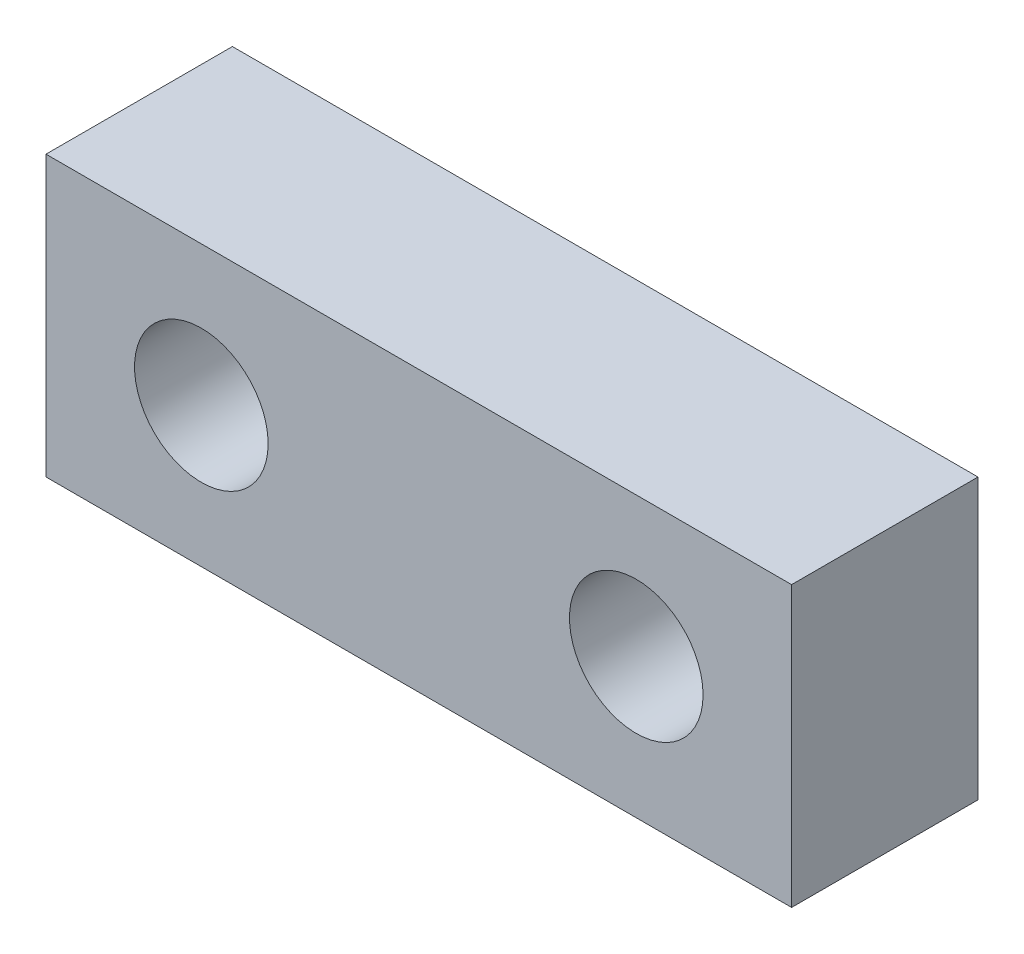
ISO-10303-21;
HEADER;
FILE_DESCRIPTION(('STEP AP214'),'2;1');
FILE_NAME('part.step','',(''),(''),'','','');
FILE_SCHEMA(('AUTOMOTIVE_DESIGN { 1 0 10303 214 1 1 1 1 }'));
ENDSEC;
DATA;
#1=APPLICATION_CONTEXT('core data for automotive mechanical design processes');
#2=APPLICATION_PROTOCOL_DEFINITION('international standard','automotive_design',2000,#1);
#3=PRODUCT_CONTEXT('',#1,'mechanical');
#4=PRODUCT('Part','Part','',(#3));
#5=PRODUCT_RELATED_PRODUCT_CATEGORY('part','',(#4));
#6=PRODUCT_DEFINITION_FORMATION('','',#4);
#7=PRODUCT_DEFINITION_CONTEXT('part definition',#1,'design');
#8=PRODUCT_DEFINITION('design','',#6,#7);
#9=PRODUCT_DEFINITION_SHAPE('','',#8);
#10=(LENGTH_UNIT() NAMED_UNIT(*) SI_UNIT(.MILLI.,.METRE.));
#11=(NAMED_UNIT(*) PLANE_ANGLE_UNIT() SI_UNIT($,.RADIAN.));
#12=(NAMED_UNIT(*) SI_UNIT($,.STERADIAN.) SOLID_ANGLE_UNIT());
#13=UNCERTAINTY_MEASURE_WITH_UNIT(LENGTH_MEASURE(1.E-05),#10,'distance_accuracy_value','');
#14=(GEOMETRIC_REPRESENTATION_CONTEXT(3) GLOBAL_UNCERTAINTY_ASSIGNED_CONTEXT((#13)) GLOBAL_UNIT_ASSIGNED_CONTEXT((#10,
#11,#12)) REPRESENTATION_CONTEXT('',''));
#15=CARTESIAN_POINT('',(0.,0.,0.));
#16=DIRECTION('',(0.,0.,1.));
#17=DIRECTION('',(1.,0.,0.));
#18=AXIS2_PLACEMENT_3D('',#15,#16,#17);
#19=CARTESIAN_POINT('',(60.,-22.5,30.));
#20=DIRECTION('',(-1.,0.,0.));
#21=DIRECTION('',(0.,0.,1.));
#22=AXIS2_PLACEMENT_3D('',#19,#20,#21);
#23=PLANE('',#22);
#24=DIRECTION('',(0.,1.,0.));
#25=VECTOR('',#24,1.);
#26=CARTESIAN_POINT('',(60.,-22.5,0.));
#27=LINE('',#26,#25);
#28=CARTESIAN_POINT('',(60.,-22.5,0.));
#29=VERTEX_POINT('',#28);
#30=CARTESIAN_POINT('',(60.,22.5,0.));
#31=VERTEX_POINT('',#30);
#32=EDGE_CURVE('E290',#29,#31,#27,.T.);
#33=ORIENTED_EDGE('',*,*,#32,.T.);
#34=DIRECTION('',(0.,0.,-1.));
#35=VECTOR('',#34,1.);
#36=CARTESIAN_POINT('',(60.,22.5,30.));
#37=LINE('',#36,#35);
#38=CARTESIAN_POINT('',(60.,22.5,30.));
#39=VERTEX_POINT('',#38);
#40=EDGE_CURVE('E11',#39,#31,#37,.T.);
#41=ORIENTED_EDGE('',*,*,#40,.F.);
#42=DIRECTION('',(0.,1.,0.));
#43=VECTOR('',#42,1.);
#44=CARTESIAN_POINT('',(60.,-22.5,30.));
#45=LINE('',#44,#43);
#46=CARTESIAN_POINT('',(60.,-22.5,30.));
#47=VERTEX_POINT('',#46);
#48=EDGE_CURVE('E294',#47,#39,#45,.T.);
#49=ORIENTED_EDGE('',*,*,#48,.F.);
#50=DIRECTION('',(0.,0.,-1.));
#51=VECTOR('',#50,1.);
#52=CARTESIAN_POINT('',(60.,-22.5,30.));
#53=LINE('',#52,#51);
#54=EDGE_CURVE('E304',#47,#29,#53,.T.);
#55=ORIENTED_EDGE('',*,*,#54,.T.);
#56=EDGE_LOOP('',(#33,#41,#49,#55));
#57=FACE_BOUND('',#56,.T.);
#58=ADVANCED_FACE('F43',(#57),#23,.F.);
#59=CARTESIAN_POINT('',(-60.,22.5,30.));
#60=DIRECTION('',(0.,-1.,0.));
#61=DIRECTION('',(0.,0.,-1.));
#62=AXIS2_PLACEMENT_3D('',#59,#60,#61);
#63=PLANE('',#62);
#64=DIRECTION('',(-1.,0.,0.));
#65=VECTOR('',#64,1.);
#66=CARTESIAN_POINT('',(-60.,22.5,0.));
#67=LINE('',#66,#65);
#68=CARTESIAN_POINT('',(-60.,22.5,0.));
#69=VERTEX_POINT('',#68);
#70=EDGE_CURVE('E308',#31,#69,#67,.T.);
#71=ORIENTED_EDGE('',*,*,#70,.T.);
#72=DIRECTION('',(0.,0.,-1.));
#73=VECTOR('',#72,1.);
#74=CARTESIAN_POINT('',(-60.,22.5,30.));
#75=LINE('',#74,#73);
#76=CARTESIAN_POINT('',(-60.,22.5,30.));
#77=VERTEX_POINT('',#76);
#78=EDGE_CURVE('E52',#77,#69,#75,.T.);
#79=ORIENTED_EDGE('',*,*,#78,.F.);
#80=DIRECTION('',(-1.,0.,0.));
#81=VECTOR('',#80,1.);
#82=CARTESIAN_POINT('',(-60.,22.5,30.));
#83=LINE('',#82,#81);
#84=EDGE_CURVE('E91',#39,#77,#83,.T.);
#85=ORIENTED_EDGE('',*,*,#84,.F.);
#86=ORIENTED_EDGE('',*,*,#40,.T.);
#87=EDGE_LOOP('',(#71,#79,#85,#86));
#88=FACE_BOUND('',#87,.T.);
#89=ADVANCED_FACE('F339',(#88),#63,.F.);
#90=CARTESIAN_POINT('',(-60.,-22.5,30.));
#91=DIRECTION('',(1.,0.,0.));
#92=DIRECTION('',(0.,0.,-1.));
#93=AXIS2_PLACEMENT_3D('',#90,#91,#92);
#94=PLANE('',#93);
#95=DIRECTION('',(0.,-1.,0.));
#96=VECTOR('',#95,1.);
#97=CARTESIAN_POINT('',(-60.,-22.5,0.));
#98=LINE('',#97,#96);
#99=CARTESIAN_POINT('',(-60.,-22.5,0.));
#100=VERTEX_POINT('',#99);
#101=EDGE_CURVE('E78',#69,#100,#98,.T.);
#102=ORIENTED_EDGE('',*,*,#101,.T.);
#103=DIRECTION('',(0.,0.,-1.));
#104=VECTOR('',#103,1.);
#105=CARTESIAN_POINT('',(-60.,-22.5,30.));
#106=LINE('',#105,#104);
#107=CARTESIAN_POINT('',(-60.,-22.5,30.));
#108=VERTEX_POINT('',#107);
#109=EDGE_CURVE('E317',#108,#100,#106,.T.);
#110=ORIENTED_EDGE('',*,*,#109,.F.);
#111=DIRECTION('',(0.,-1.,0.));
#112=VECTOR('',#111,1.);
#113=CARTESIAN_POINT('',(-60.,-22.5,30.));
#114=LINE('',#113,#112);
#115=EDGE_CURVE('E299',#77,#108,#114,.T.);
#116=ORIENTED_EDGE('',*,*,#115,.F.);
#117=ORIENTED_EDGE('',*,*,#78,.T.);
#118=EDGE_LOOP('',(#102,#110,#116,#117));
#119=FACE_BOUND('',#118,.T.);
#120=ADVANCED_FACE('F321',(#119),#94,.F.);
#121=CARTESIAN_POINT('',(-60.,-22.5,30.));
#122=DIRECTION('',(0.,1.,0.));
#123=DIRECTION('',(0.,0.,1.));
#124=AXIS2_PLACEMENT_3D('',#121,#122,#123);
#125=PLANE('',#124);
#126=CARTESIAN_POINT('',(40.6066017177982,-22.5,4.39339828220176));
#127=DIRECTION('',(0.,-1.,0.));
#128=DIRECTION('',(0.,0.,-1.));
#129=AXIS2_PLACEMENT_3D('',#126,#127,#128);
#130=CIRCLE('',#129,1.24999999999999);
#131=CARTESIAN_POINT('',(40.6066017177982,-22.5,3.14339828220177));
#132=VERTEX_POINT('',#131);
#133=EDGE_CURVE('E213',#132,#132,#130,.T.);
#134=ORIENTED_EDGE('',*,*,#133,.F.);
#135=EDGE_LOOP('',(#134));
#136=FACE_BOUND('',#135,.T.);
#137=CARTESIAN_POINT('',(19.3933982822018,-22.5,4.39339828220177));
#138=DIRECTION('',(0.,-1.,0.));
#139=DIRECTION('',(0.,0.,-1.));
#140=AXIS2_PLACEMENT_3D('',#137,#138,#139);
#141=CIRCLE('',#140,1.24999999999999);
#142=CARTESIAN_POINT('',(19.3933982822018,-22.5,3.14339828220179));
#143=VERTEX_POINT('',#142);
#144=EDGE_CURVE('E221',#143,#143,#141,.T.);
#145=ORIENTED_EDGE('',*,*,#144,.F.);
#146=EDGE_LOOP('',(#145));
#147=FACE_BOUND('',#146,.T.);
#148=CARTESIAN_POINT('',(19.3933982822018,-22.5,25.6066017177982));
#149=DIRECTION('',(0.,-1.,0.));
#150=DIRECTION('',(0.,0.,-1.));
#151=AXIS2_PLACEMENT_3D('',#148,#149,#150);
#152=CIRCLE('',#151,1.24999999999999);
#153=CARTESIAN_POINT('',(19.3933982822018,-22.5,24.3566017177982));
#154=VERTEX_POINT('',#153);
#155=EDGE_CURVE('E229',#154,#154,#152,.T.);
#156=ORIENTED_EDGE('',*,*,#155,.F.);
#157=EDGE_LOOP('',(#156));
#158=FACE_BOUND('',#157,.T.);
#159=CARTESIAN_POINT('',(40.6066017177982,-22.5,25.6066017177982));
#160=DIRECTION('',(0.,-1.,0.));
#161=DIRECTION('',(0.,0.,-1.));
#162=AXIS2_PLACEMENT_3D('',#159,#160,#161);
#163=CIRCLE('',#162,1.24999999999999);
#164=CARTESIAN_POINT('',(40.6066017177982,-22.5,24.3566017177982));
#165=VERTEX_POINT('',#164);
#166=EDGE_CURVE('E237',#165,#165,#163,.T.);
#167=ORIENTED_EDGE('',*,*,#166,.F.);
#168=EDGE_LOOP('',(#167));
#169=FACE_BOUND('',#168,.T.);
#170=CARTESIAN_POINT('',(-19.3933982822018,-22.5,4.39339828220179));
#171=DIRECTION('',(0.,-1.,0.));
#172=DIRECTION('',(0.,0.,-1.));
#173=AXIS2_PLACEMENT_3D('',#170,#171,#172);
#174=CIRCLE('',#173,1.24999999999999);
#175=CARTESIAN_POINT('',(-19.3933982822018,-22.5,3.14339828220181));
#176=VERTEX_POINT('',#175);
#177=EDGE_CURVE('E245',#176,#176,#174,.T.);
#178=ORIENTED_EDGE('',*,*,#177,.F.);
#179=EDGE_LOOP('',(#178));
#180=FACE_BOUND('',#179,.T.);
#181=CARTESIAN_POINT('',(-40.6066017177982,-22.5,4.39339828220179));
#182=DIRECTION('',(0.,-1.,0.));
#183=DIRECTION('',(0.,0.,-1.));
#184=AXIS2_PLACEMENT_3D('',#181,#182,#183);
#185=CIRCLE('',#184,1.24999999999999);
#186=CARTESIAN_POINT('',(-40.6066017177982,-22.5,3.14339828220181));
#187=VERTEX_POINT('',#186);
#188=EDGE_CURVE('E253',#187,#187,#185,.T.);
#189=ORIENTED_EDGE('',*,*,#188,.F.);
#190=EDGE_LOOP('',(#189));
#191=FACE_BOUND('',#190,.T.);
#192=CARTESIAN_POINT('',(-19.3933982822018,-22.5,25.6066017177982));
#193=DIRECTION('',(0.,-1.,0.));
#194=DIRECTION('',(0.,0.,-1.));
#195=AXIS2_PLACEMENT_3D('',#192,#193,#194);
#196=CIRCLE('',#195,1.24999999999999);
#197=CARTESIAN_POINT('',(-19.3933982822018,-22.5,24.3566017177982));
#198=VERTEX_POINT('',#197);
#199=EDGE_CURVE('E261',#198,#198,#196,.T.);
#200=ORIENTED_EDGE('',*,*,#199,.F.);
#201=EDGE_LOOP('',(#200));
#202=FACE_BOUND('',#201,.T.);
#203=CARTESIAN_POINT('',(-40.6066017177982,-22.5,25.6066017177982));
#204=DIRECTION('',(0.,-1.,0.));
#205=DIRECTION('',(0.,0.,-1.));
#206=AXIS2_PLACEMENT_3D('',#203,#204,#205);
#207=CIRCLE('',#206,1.24999999999999);
#208=CARTESIAN_POINT('',(-40.6066017177982,-22.5,24.3566017177982));
#209=VERTEX_POINT('',#208);
#210=EDGE_CURVE('E269',#209,#209,#207,.T.);
#211=ORIENTED_EDGE('',*,*,#210,.F.);
#212=EDGE_LOOP('',(#211));
#213=FACE_BOUND('',#212,.T.);
#214=DIRECTION('',(1.,0.,0.));
#215=VECTOR('',#214,1.);
#216=CARTESIAN_POINT('',(-60.,-22.5,0.));
#217=LINE('',#216,#215);
#218=EDGE_CURVE('E84',#100,#29,#217,.T.);
#219=ORIENTED_EDGE('',*,*,#218,.T.);
#220=ORIENTED_EDGE('',*,*,#54,.F.);
#221=DIRECTION('',(1.,0.,0.));
#222=VECTOR('',#221,1.);
#223=CARTESIAN_POINT('',(-60.,-22.5,30.));
#224=LINE('',#223,#222);
#225=EDGE_CURVE('E60',#108,#47,#224,.T.);
#226=ORIENTED_EDGE('',*,*,#225,.F.);
#227=ORIENTED_EDGE('',*,*,#109,.T.);
#228=EDGE_LOOP('',(#219,#220,#226,#227));
#229=FACE_BOUND('',#228,.T.);
#230=ADVANCED_FACE('F328',(#136,#147,#158,#169,#180,#191,#202,#213,#229),#125,.F.);
#231=CARTESIAN_POINT('',(0.,0.,30.));
#232=DIRECTION('',(0.,0.,-1.));
#233=DIRECTION('',(-1.,0.,0.));
#234=AXIS2_PLACEMENT_3D('',#231,#232,#233);
#235=PLANE('',#234);
#236=CARTESIAN_POINT('',(35.,0.,30.));
#237=DIRECTION('',(0.,0.,1.));
#238=DIRECTION('',(1.,0.,0.));
#239=AXIS2_PLACEMENT_3D('',#236,#237,#238);
#240=CIRCLE('',#239,10.75);
#241=CARTESIAN_POINT('',(45.75,0.,30.));
#242=VERTEX_POINT('',#241);
#243=EDGE_CURVE('E278',#242,#242,#240,.T.);
#244=ORIENTED_EDGE('',*,*,#243,.F.);
#245=EDGE_LOOP('',(#244));
#246=FACE_BOUND('',#245,.T.);
#247=CARTESIAN_POINT('',(-35.,0.,30.));
#248=DIRECTION('',(0.,0.,1.));
#249=DIRECTION('',(1.,0.,0.));
#250=AXIS2_PLACEMENT_3D('',#247,#248,#249);
#251=CIRCLE('',#250,10.75);
#252=CARTESIAN_POINT('',(-24.25,0.,30.));
#253=VERTEX_POINT('',#252);
#254=EDGE_CURVE('E286',#253,#253,#251,.T.);
#255=ORIENTED_EDGE('',*,*,#254,.F.);
#256=EDGE_LOOP('',(#255));
#257=FACE_BOUND('',#256,.T.);
#258=ORIENTED_EDGE('',*,*,#48,.T.);
#259=ORIENTED_EDGE('',*,*,#84,.T.);
#260=ORIENTED_EDGE('',*,*,#115,.T.);
#261=ORIENTED_EDGE('',*,*,#225,.T.);
#262=EDGE_LOOP('',(#258,#259,#260,#261));
#263=FACE_BOUND('',#262,.T.);
#264=ADVANCED_FACE('F330',(#246,#257,#263),#235,.F.);
#265=CARTESIAN_POINT('',(0.,0.,0.));
#266=DIRECTION('',(0.,0.,-1.));
#267=DIRECTION('',(-1.,0.,0.));
#268=AXIS2_PLACEMENT_3D('',#265,#266,#267);
#269=PLANE('',#268);
#270=CARTESIAN_POINT('',(-46.3,11.3,0.));
#271=DIRECTION('',(0.,0.,-1.));
#272=DIRECTION('',(-1.,0.,0.));
#273=AXIS2_PLACEMENT_3D('',#270,#271,#272);
#274=CIRCLE('',#273,1.64999999999999);
#275=CARTESIAN_POINT('',(-47.95,11.3,0.));
#276=VERTEX_POINT('',#275);
#277=EDGE_CURVE('E152',#276,#276,#274,.T.);
#278=ORIENTED_EDGE('',*,*,#277,.F.);
#279=EDGE_LOOP('',(#278));
#280=FACE_BOUND('',#279,.T.);
#281=CARTESIAN_POINT('',(-46.3,-11.3,0.));
#282=DIRECTION('',(0.,0.,-1.));
#283=DIRECTION('',(-1.,0.,0.));
#284=AXIS2_PLACEMENT_3D('',#281,#282,#283);
#285=CIRCLE('',#284,1.64999999999999);
#286=CARTESIAN_POINT('',(-47.95,-11.3,0.));
#287=VERTEX_POINT('',#286);
#288=EDGE_CURVE('E151',#287,#287,#285,.T.);
#289=ORIENTED_EDGE('',*,*,#288,.F.);
#290=EDGE_LOOP('',(#289));
#291=FACE_BOUND('',#290,.T.);
#292=CARTESIAN_POINT('',(-23.7,-11.3,0.));
#293=DIRECTION('',(0.,0.,-1.));
#294=DIRECTION('',(-1.,0.,0.));
#295=AXIS2_PLACEMENT_3D('',#292,#293,#294);
#296=CIRCLE('',#295,1.64999999999999);
#297=CARTESIAN_POINT('',(-25.35,-11.3,0.));
#298=VERTEX_POINT('',#297);
#299=EDGE_CURVE('E165',#298,#298,#296,.T.);
#300=ORIENTED_EDGE('',*,*,#299,.F.);
#301=EDGE_LOOP('',(#300));
#302=FACE_BOUND('',#301,.T.);
#303=CARTESIAN_POINT('',(-23.7,11.3,0.));
#304=DIRECTION('',(0.,0.,-1.));
#305=DIRECTION('',(-1.,0.,0.));
#306=AXIS2_PLACEMENT_3D('',#303,#304,#305);
#307=CIRCLE('',#306,1.64999999999999);
#308=CARTESIAN_POINT('',(-25.35,11.3,0.));
#309=VERTEX_POINT('',#308);
#310=EDGE_CURVE('E173',#309,#309,#307,.T.);
#311=ORIENTED_EDGE('',*,*,#310,.F.);
#312=EDGE_LOOP('',(#311));
#313=FACE_BOUND('',#312,.T.);
#314=CARTESIAN_POINT('',(23.7,11.3,0.));
#315=DIRECTION('',(0.,0.,-1.));
#316=DIRECTION('',(-1.,0.,0.));
#317=AXIS2_PLACEMENT_3D('',#314,#315,#316);
#318=CIRCLE('',#317,1.64999999999999);
#319=CARTESIAN_POINT('',(22.05,11.3,0.));
#320=VERTEX_POINT('',#319);
#321=EDGE_CURVE('E181',#320,#320,#318,.T.);
#322=ORIENTED_EDGE('',*,*,#321,.F.);
#323=EDGE_LOOP('',(#322));
#324=FACE_BOUND('',#323,.T.);
#325=CARTESIAN_POINT('',(23.7,-11.3,0.));
#326=DIRECTION('',(0.,0.,-1.));
#327=DIRECTION('',(-1.,0.,0.));
#328=AXIS2_PLACEMENT_3D('',#325,#326,#327);
#329=CIRCLE('',#328,1.64999999999999);
#330=CARTESIAN_POINT('',(22.05,-11.3,0.));
#331=VERTEX_POINT('',#330);
#332=EDGE_CURVE('E189',#331,#331,#329,.T.);
#333=ORIENTED_EDGE('',*,*,#332,.F.);
#334=EDGE_LOOP('',(#333));
#335=FACE_BOUND('',#334,.T.);
#336=CARTESIAN_POINT('',(46.3,-11.3,0.));
#337=DIRECTION('',(0.,0.,-1.));
#338=DIRECTION('',(-1.,0.,0.));
#339=AXIS2_PLACEMENT_3D('',#336,#337,#338);
#340=CIRCLE('',#339,1.64999999999999);
#341=CARTESIAN_POINT('',(44.65,-11.3,0.));
#342=VERTEX_POINT('',#341);
#343=EDGE_CURVE('E197',#342,#342,#340,.T.);
#344=ORIENTED_EDGE('',*,*,#343,.F.);
#345=EDGE_LOOP('',(#344));
#346=FACE_BOUND('',#345,.T.);
#347=CARTESIAN_POINT('',(46.3,11.3,0.));
#348=DIRECTION('',(0.,0.,-1.));
#349=DIRECTION('',(-1.,0.,0.));
#350=AXIS2_PLACEMENT_3D('',#347,#348,#349);
#351=CIRCLE('',#350,1.64999999999999);
#352=CARTESIAN_POINT('',(44.65,11.3,0.));
#353=VERTEX_POINT('',#352);
#354=EDGE_CURVE('E205',#353,#353,#351,.T.);
#355=ORIENTED_EDGE('',*,*,#354,.F.);
#356=EDGE_LOOP('',(#355));
#357=FACE_BOUND('',#356,.T.);
#358=CARTESIAN_POINT('',(35.,0.,0.));
#359=DIRECTION('',(0.,0.,-1.));
#360=DIRECTION('',(-1.,0.,0.));
#361=AXIS2_PLACEMENT_3D('',#358,#359,#360);
#362=CIRCLE('',#361,10.75);
#363=CARTESIAN_POINT('',(24.25,0.,0.));
#364=VERTEX_POINT('',#363);
#365=EDGE_CURVE('E277',#364,#364,#362,.F.);
#366=ORIENTED_EDGE('',*,*,#365,.T.);
#367=EDGE_LOOP('',(#366));
#368=FACE_BOUND('',#367,.T.);
#369=CARTESIAN_POINT('',(-35.,0.,0.));
#370=DIRECTION('',(0.,0.,-1.));
#371=DIRECTION('',(-1.,0.,0.));
#372=AXIS2_PLACEMENT_3D('',#369,#370,#371);
#373=CIRCLE('',#372,10.75);
#374=CARTESIAN_POINT('',(-45.75,0.,0.));
#375=VERTEX_POINT('',#374);
#376=EDGE_CURVE('E282',#375,#375,#373,.F.);
#377=ORIENTED_EDGE('',*,*,#376,.T.);
#378=EDGE_LOOP('',(#377));
#379=FACE_BOUND('',#378,.T.);
#380=ORIENTED_EDGE('',*,*,#32,.F.);
#381=ORIENTED_EDGE('',*,*,#218,.F.);
#382=ORIENTED_EDGE('',*,*,#101,.F.);
#383=ORIENTED_EDGE('',*,*,#70,.F.);
#384=EDGE_LOOP('',(#380,#381,#382,#383));
#385=FACE_BOUND('',#384,.T.);
#386=ADVANCED_FACE('F324',(#280,#291,#302,#313,#324,#335,#346,#357,#368,#379,#385),#269,.T.);
#387=CARTESIAN_POINT('',(-35.,0.,-0.001000000000001));
#388=DIRECTION('',(0.,0.,1.));
#389=DIRECTION('',(1.,0.,0.));
#390=AXIS2_PLACEMENT_3D('',#387,#388,#389);
#391=CYLINDRICAL_SURFACE('',#390,10.75);
#392=ORIENTED_EDGE('',*,*,#376,.F.);
#393=EDGE_LOOP('',(#392));
#394=FACE_BOUND('',#393,.T.);
#395=ORIENTED_EDGE('',*,*,#254,.T.);
#396=EDGE_LOOP('',(#395));
#397=FACE_BOUND('',#396,.T.);
#398=ADVANCED_FACE('F368',(#394,#397),#391,.F.);
#399=CARTESIAN_POINT('',(35.,0.,-0.001000000000001));
#400=DIRECTION('',(0.,0.,1.));
#401=DIRECTION('',(1.,0.,0.));
#402=AXIS2_PLACEMENT_3D('',#399,#400,#401);
#403=CYLINDRICAL_SURFACE('',#402,10.75);
#404=ORIENTED_EDGE('',*,*,#365,.F.);
#405=EDGE_LOOP('',(#404));
#406=FACE_BOUND('',#405,.T.);
#407=ORIENTED_EDGE('',*,*,#243,.T.);
#408=EDGE_LOOP('',(#407));
#409=FACE_BOUND('',#408,.T.);
#410=ADVANCED_FACE('F373',(#406,#409),#403,.F.);
#411=CARTESIAN_POINT('',(-40.6066017177982,-15.,25.6066017177982));
#412=DIRECTION('',(0.,-1.,0.));
#413=DIRECTION('',(0.,0.,-1.));
#414=AXIS2_PLACEMENT_3D('',#411,#412,#413);
#415=CONICAL_SURFACE('',#414,1.24999999999999,1.02974425867665);
#416=CARTESIAN_POINT('',(-40.6066017177982,-14.2489242262155,25.6066017177982));
#417=VERTEX_POINT('',#416);
#418=VERTEX_LOOP('',#417);
#419=FACE_BOUND('',#418,.T.);
#420=CARTESIAN_POINT('',(-40.6066017177982,-15.,25.6066017177982));
#421=DIRECTION('',(0.,-1.,0.));
#422=DIRECTION('',(0.,0.,-1.));
#423=AXIS2_PLACEMENT_3D('',#420,#421,#422);
#424=CIRCLE('',#423,1.24999999999999);
#425=CARTESIAN_POINT('',(-40.6066017177982,-15.,24.3566017177982));
#426=VERTEX_POINT('',#425);
#427=EDGE_CURVE('E273',#426,#426,#424,.T.);
#428=ORIENTED_EDGE('',*,*,#427,.T.);
#429=EDGE_LOOP('',(#428));
#430=FACE_BOUND('',#429,.T.);
#431=ADVANCED_FACE('F382',(#419,#430),#415,.F.);
#432=CARTESIAN_POINT('',(-40.6066017177982,-22.5,25.6066017177982));
#433=DIRECTION('',(0.,-1.,0.));
#434=DIRECTION('',(0.,0.,-1.));
#435=AXIS2_PLACEMENT_3D('',#432,#433,#434);
#436=CYLINDRICAL_SURFACE('',#435,1.24999999999999);
#437=ORIENTED_EDGE('',*,*,#427,.F.);
#438=EDGE_LOOP('',(#437));
#439=FACE_BOUND('',#438,.T.);
#440=ORIENTED_EDGE('',*,*,#210,.T.);
#441=EDGE_LOOP('',(#440));
#442=FACE_BOUND('',#441,.T.);
#443=ADVANCED_FACE('F396',(#439,#442),#436,.F.);
#444=CARTESIAN_POINT('',(-19.3933982822018,-15.,25.6066017177982));
#445=DIRECTION('',(0.,-1.,0.));
#446=DIRECTION('',(0.,0.,-1.));
#447=AXIS2_PLACEMENT_3D('',#444,#445,#446);
#448=CONICAL_SURFACE('',#447,1.24999999999999,1.02974425867665);
#449=CARTESIAN_POINT('',(-19.3933982822018,-14.2489242262155,25.6066017177982));
#450=VERTEX_POINT('',#449);
#451=VERTEX_LOOP('',#450);
#452=FACE_BOUND('',#451,.T.);
#453=CARTESIAN_POINT('',(-19.3933982822018,-15.,25.6066017177982));
#454=DIRECTION('',(0.,-1.,0.));
#455=DIRECTION('',(0.,0.,-1.));
#456=AXIS2_PLACEMENT_3D('',#453,#454,#455);
#457=CIRCLE('',#456,1.24999999999999);
#458=CARTESIAN_POINT('',(-19.3933982822018,-15.,24.3566017177982));
#459=VERTEX_POINT('',#458);
#460=EDGE_CURVE('E265',#459,#459,#457,.T.);
#461=ORIENTED_EDGE('',*,*,#460,.T.);
#462=EDGE_LOOP('',(#461));
#463=FACE_BOUND('',#462,.T.);
#464=ADVANCED_FACE('F407',(#452,#463),#448,.F.);
#465=CARTESIAN_POINT('',(-19.3933982822018,-22.5,25.6066017177982));
#466=DIRECTION('',(0.,-1.,0.));
#467=DIRECTION('',(0.,0.,-1.));
#468=AXIS2_PLACEMENT_3D('',#465,#466,#467);
#469=CYLINDRICAL_SURFACE('',#468,1.24999999999999);
#470=ORIENTED_EDGE('',*,*,#460,.F.);
#471=EDGE_LOOP('',(#470));
#472=FACE_BOUND('',#471,.T.);
#473=ORIENTED_EDGE('',*,*,#199,.T.);
#474=EDGE_LOOP('',(#473));
#475=FACE_BOUND('',#474,.T.);
#476=ADVANCED_FACE('F419',(#472,#475),#469,.F.);
#477=CARTESIAN_POINT('',(-40.6066017177982,-15.,4.39339828220179));
#478=DIRECTION('',(0.,-1.,0.));
#479=DIRECTION('',(0.,0.,-1.));
#480=AXIS2_PLACEMENT_3D('',#477,#478,#479);
#481=CONICAL_SURFACE('',#480,1.24999999999999,1.02974425867665);
#482=CARTESIAN_POINT('',(-40.6066017177982,-14.2489242262155,4.39339828220179));
#483=VERTEX_POINT('',#482);
#484=VERTEX_LOOP('',#483);
#485=FACE_BOUND('',#484,.T.);
#486=CARTESIAN_POINT('',(-40.6066017177982,-15.,4.39339828220179));
#487=DIRECTION('',(0.,-1.,0.));
#488=DIRECTION('',(0.,0.,-1.));
#489=AXIS2_PLACEMENT_3D('',#486,#487,#488);
#490=CIRCLE('',#489,1.24999999999999);
#491=CARTESIAN_POINT('',(-40.6066017177982,-15.,3.14339828220181));
#492=VERTEX_POINT('',#491);
#493=EDGE_CURVE('E257',#492,#492,#490,.T.);
#494=ORIENTED_EDGE('',*,*,#493,.T.);
#495=EDGE_LOOP('',(#494));
#496=FACE_BOUND('',#495,.T.);
#497=ADVANCED_FACE('F429',(#485,#496),#481,.F.);
#498=CARTESIAN_POINT('',(-40.6066017177982,-22.5,4.39339828220179));
#499=DIRECTION('',(0.,-1.,0.));
#500=DIRECTION('',(0.,0.,-1.));
#501=AXIS2_PLACEMENT_3D('',#498,#499,#500);
#502=CYLINDRICAL_SURFACE('',#501,1.24999999999999);
#503=ORIENTED_EDGE('',*,*,#493,.F.);
#504=EDGE_LOOP('',(#503));
#505=FACE_BOUND('',#504,.T.);
#506=ORIENTED_EDGE('',*,*,#188,.T.);
#507=EDGE_LOOP('',(#506));
#508=FACE_BOUND('',#507,.T.);
#509=ADVANCED_FACE('F441',(#505,#508),#502,.F.);
#510=CARTESIAN_POINT('',(-19.3933982822018,-15.,4.39339828220179));
#511=DIRECTION('',(0.,-1.,0.));
#512=DIRECTION('',(0.,0.,-1.));
#513=AXIS2_PLACEMENT_3D('',#510,#511,#512);
#514=CONICAL_SURFACE('',#513,1.24999999999999,1.02974425867665);
#515=CARTESIAN_POINT('',(-19.3933982822018,-14.2489242262155,4.39339828220179));
#516=VERTEX_POINT('',#515);
#517=VERTEX_LOOP('',#516);
#518=FACE_BOUND('',#517,.T.);
#519=CARTESIAN_POINT('',(-19.3933982822018,-15.,4.39339828220179));
#520=DIRECTION('',(0.,-1.,0.));
#521=DIRECTION('',(0.,0.,-1.));
#522=AXIS2_PLACEMENT_3D('',#519,#520,#521);
#523=CIRCLE('',#522,1.24999999999999);
#524=CARTESIAN_POINT('',(-19.3933982822018,-15.,3.14339828220181));
#525=VERTEX_POINT('',#524);
#526=EDGE_CURVE('E249',#525,#525,#523,.T.);
#527=ORIENTED_EDGE('',*,*,#526,.T.);
#528=EDGE_LOOP('',(#527));
#529=FACE_BOUND('',#528,.T.);
#530=ADVANCED_FACE('F451',(#518,#529),#514,.F.);
#531=CARTESIAN_POINT('',(-19.3933982822018,-22.5,4.39339828220179));
#532=DIRECTION('',(0.,-1.,0.));
#533=DIRECTION('',(0.,0.,-1.));
#534=AXIS2_PLACEMENT_3D('',#531,#532,#533);
#535=CYLINDRICAL_SURFACE('',#534,1.24999999999999);
#536=ORIENTED_EDGE('',*,*,#526,.F.);
#537=EDGE_LOOP('',(#536));
#538=FACE_BOUND('',#537,.T.);
#539=ORIENTED_EDGE('',*,*,#177,.T.);
#540=EDGE_LOOP('',(#539));
#541=FACE_BOUND('',#540,.T.);
#542=ADVANCED_FACE('F463',(#538,#541),#535,.F.);
#543=CARTESIAN_POINT('',(40.6066017177982,-15.,25.6066017177982));
#544=DIRECTION('',(0.,-1.,0.));
#545=DIRECTION('',(0.,0.,-1.));
#546=AXIS2_PLACEMENT_3D('',#543,#544,#545);
#547=CONICAL_SURFACE('',#546,1.24999999999999,1.02974425867665);
#548=CARTESIAN_POINT('',(40.6066017177982,-14.2489242262155,25.6066017177982));
#549=VERTEX_POINT('',#548);
#550=VERTEX_LOOP('',#549);
#551=FACE_BOUND('',#550,.T.);
#552=CARTESIAN_POINT('',(40.6066017177982,-15.,25.6066017177982));
#553=DIRECTION('',(0.,-1.,0.));
#554=DIRECTION('',(0.,0.,-1.));
#555=AXIS2_PLACEMENT_3D('',#552,#553,#554);
#556=CIRCLE('',#555,1.24999999999999);
#557=CARTESIAN_POINT('',(40.6066017177982,-15.,24.3566017177982));
#558=VERTEX_POINT('',#557);
#559=EDGE_CURVE('E241',#558,#558,#556,.T.);
#560=ORIENTED_EDGE('',*,*,#559,.T.);
#561=EDGE_LOOP('',(#560));
#562=FACE_BOUND('',#561,.T.);
#563=ADVANCED_FACE('F473',(#551,#562),#547,.F.);
#564=CARTESIAN_POINT('',(40.6066017177982,-22.5,25.6066017177982));
#565=DIRECTION('',(0.,-1.,0.));
#566=DIRECTION('',(0.,0.,-1.));
#567=AXIS2_PLACEMENT_3D('',#564,#565,#566);
#568=CYLINDRICAL_SURFACE('',#567,1.24999999999999);
#569=ORIENTED_EDGE('',*,*,#559,.F.);
#570=EDGE_LOOP('',(#569));
#571=FACE_BOUND('',#570,.T.);
#572=ORIENTED_EDGE('',*,*,#166,.T.);
#573=EDGE_LOOP('',(#572));
#574=FACE_BOUND('',#573,.T.);
#575=ADVANCED_FACE('F485',(#571,#574),#568,.F.);
#576=CARTESIAN_POINT('',(19.3933982822018,-15.,25.6066017177982));
#577=DIRECTION('',(0.,-1.,0.));
#578=DIRECTION('',(0.,0.,-1.));
#579=AXIS2_PLACEMENT_3D('',#576,#577,#578);
#580=CONICAL_SURFACE('',#579,1.24999999999999,1.02974425867665);
#581=CARTESIAN_POINT('',(19.3933982822018,-14.2489242262155,25.6066017177982));
#582=VERTEX_POINT('',#581);
#583=VERTEX_LOOP('',#582);
#584=FACE_BOUND('',#583,.T.);
#585=CARTESIAN_POINT('',(19.3933982822018,-15.,25.6066017177982));
#586=DIRECTION('',(0.,-1.,0.));
#587=DIRECTION('',(0.,0.,-1.));
#588=AXIS2_PLACEMENT_3D('',#585,#586,#587);
#589=CIRCLE('',#588,1.24999999999999);
#590=CARTESIAN_POINT('',(19.3933982822018,-15.,24.3566017177982));
#591=VERTEX_POINT('',#590);
#592=EDGE_CURVE('E233',#591,#591,#589,.T.);
#593=ORIENTED_EDGE('',*,*,#592,.T.);
#594=EDGE_LOOP('',(#593));
#595=FACE_BOUND('',#594,.T.);
#596=ADVANCED_FACE('F495',(#584,#595),#580,.F.);
#597=CARTESIAN_POINT('',(19.3933982822018,-22.5,25.6066017177982));
#598=DIRECTION('',(0.,-1.,0.));
#599=DIRECTION('',(0.,0.,-1.));
#600=AXIS2_PLACEMENT_3D('',#597,#598,#599);
#601=CYLINDRICAL_SURFACE('',#600,1.24999999999999);
#602=ORIENTED_EDGE('',*,*,#592,.F.);
#603=EDGE_LOOP('',(#602));
#604=FACE_BOUND('',#603,.T.);
#605=ORIENTED_EDGE('',*,*,#155,.T.);
#606=EDGE_LOOP('',(#605));
#607=FACE_BOUND('',#606,.T.);
#608=ADVANCED_FACE('F507',(#604,#607),#601,.F.);
#609=CARTESIAN_POINT('',(19.3933982822018,-15.,4.39339828220177));
#610=DIRECTION('',(0.,-1.,0.));
#611=DIRECTION('',(0.,0.,-1.));
#612=AXIS2_PLACEMENT_3D('',#609,#610,#611);
#613=CONICAL_SURFACE('',#612,1.24999999999999,1.02974425867665);
#614=CARTESIAN_POINT('',(19.3933982822018,-14.2489242262155,4.39339828220177));
#615=VERTEX_POINT('',#614);
#616=VERTEX_LOOP('',#615);
#617=FACE_BOUND('',#616,.T.);
#618=CARTESIAN_POINT('',(19.3933982822018,-15.,4.39339828220177));
#619=DIRECTION('',(0.,-1.,0.));
#620=DIRECTION('',(0.,0.,-1.));
#621=AXIS2_PLACEMENT_3D('',#618,#619,#620);
#622=CIRCLE('',#621,1.24999999999999);
#623=CARTESIAN_POINT('',(19.3933982822018,-15.,3.14339828220179));
#624=VERTEX_POINT('',#623);
#625=EDGE_CURVE('E225',#624,#624,#622,.T.);
#626=ORIENTED_EDGE('',*,*,#625,.T.);
#627=EDGE_LOOP('',(#626));
#628=FACE_BOUND('',#627,.T.);
#629=ADVANCED_FACE('F517',(#617,#628),#613,.F.);
#630=CARTESIAN_POINT('',(19.3933982822018,-22.5,4.39339828220177));
#631=DIRECTION('',(0.,-1.,0.));
#632=DIRECTION('',(0.,0.,-1.));
#633=AXIS2_PLACEMENT_3D('',#630,#631,#632);
#634=CYLINDRICAL_SURFACE('',#633,1.24999999999999);
#635=ORIENTED_EDGE('',*,*,#625,.F.);
#636=EDGE_LOOP('',(#635));
#637=FACE_BOUND('',#636,.T.);
#638=ORIENTED_EDGE('',*,*,#144,.T.);
#639=EDGE_LOOP('',(#638));
#640=FACE_BOUND('',#639,.T.);
#641=ADVANCED_FACE('F529',(#637,#640),#634,.F.);
#642=CARTESIAN_POINT('',(40.6066017177982,-15.,4.39339828220176));
#643=DIRECTION('',(0.,-1.,0.));
#644=DIRECTION('',(0.,0.,-1.));
#645=AXIS2_PLACEMENT_3D('',#642,#643,#644);
#646=CONICAL_SURFACE('',#645,1.24999999999999,1.02974425867665);
#647=CARTESIAN_POINT('',(40.6066017177982,-14.2489242262155,4.39339828220176));
#648=VERTEX_POINT('',#647);
#649=VERTEX_LOOP('',#648);
#650=FACE_BOUND('',#649,.T.);
#651=CARTESIAN_POINT('',(40.6066017177982,-15.,4.39339828220176));
#652=DIRECTION('',(0.,-1.,0.));
#653=DIRECTION('',(0.,0.,-1.));
#654=AXIS2_PLACEMENT_3D('',#651,#652,#653);
#655=CIRCLE('',#654,1.24999999999999);
#656=CARTESIAN_POINT('',(40.6066017177982,-15.,3.14339828220177));
#657=VERTEX_POINT('',#656);
#658=EDGE_CURVE('E217',#657,#657,#655,.T.);
#659=ORIENTED_EDGE('',*,*,#658,.T.);
#660=EDGE_LOOP('',(#659));
#661=FACE_BOUND('',#660,.T.);
#662=ADVANCED_FACE('F539',(#650,#661),#646,.F.);
#663=CARTESIAN_POINT('',(40.6066017177982,-22.5,4.39339828220176));
#664=DIRECTION('',(0.,-1.,0.));
#665=DIRECTION('',(0.,0.,-1.));
#666=AXIS2_PLACEMENT_3D('',#663,#664,#665);
#667=CYLINDRICAL_SURFACE('',#666,1.24999999999999);
#668=ORIENTED_EDGE('',*,*,#658,.F.);
#669=EDGE_LOOP('',(#668));
#670=FACE_BOUND('',#669,.T.);
#671=ORIENTED_EDGE('',*,*,#133,.T.);
#672=EDGE_LOOP('',(#671));
#673=FACE_BOUND('',#672,.T.);
#674=ADVANCED_FACE('F551',(#670,#673),#667,.F.);
#675=CARTESIAN_POINT('',(46.3,11.3,10.1));
#676=DIRECTION('',(0.,0.,-1.));
#677=DIRECTION('',(-1.,0.,0.));
#678=AXIS2_PLACEMENT_3D('',#675,#676,#677);
#679=CONICAL_SURFACE('',#678,1.64999999999999,1.02974425867665);
#680=CARTESIAN_POINT('',(46.3,11.3,11.0914200213955));
#681=VERTEX_POINT('',#680);
#682=VERTEX_LOOP('',#681);
#683=FACE_BOUND('',#682,.T.);
#684=CARTESIAN_POINT('',(46.3,11.3,10.1));
#685=DIRECTION('',(0.,0.,-1.));
#686=DIRECTION('',(-1.,0.,0.));
#687=AXIS2_PLACEMENT_3D('',#684,#685,#686);
#688=CIRCLE('',#687,1.64999999999999);
#689=CARTESIAN_POINT('',(44.65,11.3,10.1));
#690=VERTEX_POINT('',#689);
#691=EDGE_CURVE('E209',#690,#690,#688,.T.);
#692=ORIENTED_EDGE('',*,*,#691,.T.);
#693=EDGE_LOOP('',(#692));
#694=FACE_BOUND('',#693,.T.);
#695=ADVANCED_FACE('F561',(#683,#694),#679,.F.);
#696=CARTESIAN_POINT('',(46.3,11.3,0.));
#697=DIRECTION('',(0.,0.,-1.));
#698=DIRECTION('',(-1.,0.,0.));
#699=AXIS2_PLACEMENT_3D('',#696,#697,#698);
#700=CYLINDRICAL_SURFACE('',#699,1.64999999999999);
#701=ORIENTED_EDGE('',*,*,#691,.F.);
#702=EDGE_LOOP('',(#701));
#703=FACE_BOUND('',#702,.T.);
#704=ORIENTED_EDGE('',*,*,#354,.T.);
#705=EDGE_LOOP('',(#704));
#706=FACE_BOUND('',#705,.T.);
#707=ADVANCED_FACE('F579',(#703,#706),#700,.F.);
#708=CARTESIAN_POINT('',(46.3,-11.3,10.1));
#709=DIRECTION('',(0.,0.,-1.));
#710=DIRECTION('',(-1.,0.,0.));
#711=AXIS2_PLACEMENT_3D('',#708,#709,#710);
#712=CONICAL_SURFACE('',#711,1.64999999999999,1.02974425867665);
#713=CARTESIAN_POINT('',(46.3,-11.3,11.0914200213955));
#714=VERTEX_POINT('',#713);
#715=VERTEX_LOOP('',#714);
#716=FACE_BOUND('',#715,.T.);
#717=CARTESIAN_POINT('',(46.3,-11.3,10.1));
#718=DIRECTION('',(0.,0.,-1.));
#719=DIRECTION('',(-1.,0.,0.));
#720=AXIS2_PLACEMENT_3D('',#717,#718,#719);
#721=CIRCLE('',#720,1.64999999999999);
#722=CARTESIAN_POINT('',(44.65,-11.3,10.1));
#723=VERTEX_POINT('',#722);
#724=EDGE_CURVE('E201',#723,#723,#721,.T.);
#725=ORIENTED_EDGE('',*,*,#724,.T.);
#726=EDGE_LOOP('',(#725));
#727=FACE_BOUND('',#726,.T.);
#728=ADVANCED_FACE('F590',(#716,#727),#712,.F.);
#729=CARTESIAN_POINT('',(46.3,-11.3,0.));
#730=DIRECTION('',(0.,0.,-1.));
#731=DIRECTION('',(-1.,0.,0.));
#732=AXIS2_PLACEMENT_3D('',#729,#730,#731);
#733=CYLINDRICAL_SURFACE('',#732,1.64999999999999);
#734=ORIENTED_EDGE('',*,*,#724,.F.);
#735=EDGE_LOOP('',(#734));
#736=FACE_BOUND('',#735,.T.);
#737=ORIENTED_EDGE('',*,*,#343,.T.);
#738=EDGE_LOOP('',(#737));
#739=FACE_BOUND('',#738,.T.);
#740=ADVANCED_FACE('F601',(#736,#739),#733,.F.);
#741=CARTESIAN_POINT('',(23.7,-11.3,10.1));
#742=DIRECTION('',(0.,0.,-1.));
#743=DIRECTION('',(-1.,0.,0.));
#744=AXIS2_PLACEMENT_3D('',#741,#742,#743);
#745=CONICAL_SURFACE('',#744,1.64999999999999,1.02974425867665);
#746=CARTESIAN_POINT('',(23.7,-11.3,11.0914200213955));
#747=VERTEX_POINT('',#746);
#748=VERTEX_LOOP('',#747);
#749=FACE_BOUND('',#748,.T.);
#750=CARTESIAN_POINT('',(23.7,-11.3,10.1));
#751=DIRECTION('',(0.,0.,-1.));
#752=DIRECTION('',(-1.,0.,0.));
#753=AXIS2_PLACEMENT_3D('',#750,#751,#752);
#754=CIRCLE('',#753,1.64999999999999);
#755=CARTESIAN_POINT('',(22.05,-11.3,10.1));
#756=VERTEX_POINT('',#755);
#757=EDGE_CURVE('E193',#756,#756,#754,.T.);
#758=ORIENTED_EDGE('',*,*,#757,.T.);
#759=EDGE_LOOP('',(#758));
#760=FACE_BOUND('',#759,.T.);
#761=ADVANCED_FACE('F611',(#749,#760),#745,.F.);
#762=CARTESIAN_POINT('',(23.7,-11.3,0.));
#763=DIRECTION('',(0.,0.,-1.));
#764=DIRECTION('',(-1.,0.,0.));
#765=AXIS2_PLACEMENT_3D('',#762,#763,#764);
#766=CYLINDRICAL_SURFACE('',#765,1.64999999999999);
#767=ORIENTED_EDGE('',*,*,#757,.F.);
#768=EDGE_LOOP('',(#767));
#769=FACE_BOUND('',#768,.T.);
#770=ORIENTED_EDGE('',*,*,#332,.T.);
#771=EDGE_LOOP('',(#770));
#772=FACE_BOUND('',#771,.T.);
#773=ADVANCED_FACE('F623',(#769,#772),#766,.F.);
#774=CARTESIAN_POINT('',(23.7,11.3,10.1));
#775=DIRECTION('',(0.,0.,-1.));
#776=DIRECTION('',(-1.,0.,0.));
#777=AXIS2_PLACEMENT_3D('',#774,#775,#776);
#778=CONICAL_SURFACE('',#777,1.64999999999999,1.02974425867665);
#779=CARTESIAN_POINT('',(23.7,11.3,11.0914200213955));
#780=VERTEX_POINT('',#779);
#781=VERTEX_LOOP('',#780);
#782=FACE_BOUND('',#781,.T.);
#783=CARTESIAN_POINT('',(23.7,11.3,10.1));
#784=DIRECTION('',(0.,0.,-1.));
#785=DIRECTION('',(-1.,0.,0.));
#786=AXIS2_PLACEMENT_3D('',#783,#784,#785);
#787=CIRCLE('',#786,1.64999999999999);
#788=CARTESIAN_POINT('',(22.05,11.3,10.1));
#789=VERTEX_POINT('',#788);
#790=EDGE_CURVE('E185',#789,#789,#787,.T.);
#791=ORIENTED_EDGE('',*,*,#790,.T.);
#792=EDGE_LOOP('',(#791));
#793=FACE_BOUND('',#792,.T.);
#794=ADVANCED_FACE('F633',(#782,#793),#778,.F.);
#795=CARTESIAN_POINT('',(23.7,11.3,0.));
#796=DIRECTION('',(0.,0.,-1.));
#797=DIRECTION('',(-1.,0.,0.));
#798=AXIS2_PLACEMENT_3D('',#795,#796,#797);
#799=CYLINDRICAL_SURFACE('',#798,1.64999999999999);
#800=ORIENTED_EDGE('',*,*,#790,.F.);
#801=EDGE_LOOP('',(#800));
#802=FACE_BOUND('',#801,.T.);
#803=ORIENTED_EDGE('',*,*,#321,.T.);
#804=EDGE_LOOP('',(#803));
#805=FACE_BOUND('',#804,.T.);
#806=ADVANCED_FACE('F645',(#802,#805),#799,.F.);
#807=CARTESIAN_POINT('',(-23.7,11.3,10.1));
#808=DIRECTION('',(0.,0.,-1.));
#809=DIRECTION('',(-1.,0.,0.));
#810=AXIS2_PLACEMENT_3D('',#807,#808,#809);
#811=CONICAL_SURFACE('',#810,1.64999999999999,1.02974425867665);
#812=CARTESIAN_POINT('',(-23.7,11.3,11.0914200213955));
#813=VERTEX_POINT('',#812);
#814=VERTEX_LOOP('',#813);
#815=FACE_BOUND('',#814,.T.);
#816=CARTESIAN_POINT('',(-23.7,11.3,10.1));
#817=DIRECTION('',(0.,0.,-1.));
#818=DIRECTION('',(-1.,0.,0.));
#819=AXIS2_PLACEMENT_3D('',#816,#817,#818);
#820=CIRCLE('',#819,1.64999999999999);
#821=CARTESIAN_POINT('',(-25.35,11.3,10.1));
#822=VERTEX_POINT('',#821);
#823=EDGE_CURVE('E177',#822,#822,#820,.T.);
#824=ORIENTED_EDGE('',*,*,#823,.T.);
#825=EDGE_LOOP('',(#824));
#826=FACE_BOUND('',#825,.T.);
#827=ADVANCED_FACE('F655',(#815,#826),#811,.F.);
#828=CARTESIAN_POINT('',(-23.7,11.3,0.));
#829=DIRECTION('',(0.,0.,-1.));
#830=DIRECTION('',(-1.,0.,0.));
#831=AXIS2_PLACEMENT_3D('',#828,#829,#830);
#832=CYLINDRICAL_SURFACE('',#831,1.64999999999999);
#833=ORIENTED_EDGE('',*,*,#823,.F.);
#834=EDGE_LOOP('',(#833));
#835=FACE_BOUND('',#834,.T.);
#836=ORIENTED_EDGE('',*,*,#310,.T.);
#837=EDGE_LOOP('',(#836));
#838=FACE_BOUND('',#837,.T.);
#839=ADVANCED_FACE('F667',(#835,#838),#832,.F.);
#840=CARTESIAN_POINT('',(-23.7,-11.3,10.1));
#841=DIRECTION('',(0.,0.,-1.));
#842=DIRECTION('',(-1.,0.,0.));
#843=AXIS2_PLACEMENT_3D('',#840,#841,#842);
#844=CONICAL_SURFACE('',#843,1.64999999999999,1.02974425867665);
#845=CARTESIAN_POINT('',(-23.7,-11.3,11.0914200213955));
#846=VERTEX_POINT('',#845);
#847=VERTEX_LOOP('',#846);
#848=FACE_BOUND('',#847,.T.);
#849=CARTESIAN_POINT('',(-23.7,-11.3,10.1));
#850=DIRECTION('',(0.,0.,-1.));
#851=DIRECTION('',(-1.,0.,0.));
#852=AXIS2_PLACEMENT_3D('',#849,#850,#851);
#853=CIRCLE('',#852,1.64999999999999);
#854=CARTESIAN_POINT('',(-25.35,-11.3,10.1));
#855=VERTEX_POINT('',#854);
#856=EDGE_CURVE('E169',#855,#855,#853,.T.);
#857=ORIENTED_EDGE('',*,*,#856,.T.);
#858=EDGE_LOOP('',(#857));
#859=FACE_BOUND('',#858,.T.);
#860=ADVANCED_FACE('F677',(#848,#859),#844,.F.);
#861=CARTESIAN_POINT('',(-23.7,-11.3,0.));
#862=DIRECTION('',(0.,0.,-1.));
#863=DIRECTION('',(-1.,0.,0.));
#864=AXIS2_PLACEMENT_3D('',#861,#862,#863);
#865=CYLINDRICAL_SURFACE('',#864,1.64999999999999);
#866=ORIENTED_EDGE('',*,*,#856,.F.);
#867=EDGE_LOOP('',(#866));
#868=FACE_BOUND('',#867,.T.);
#869=ORIENTED_EDGE('',*,*,#299,.T.);
#870=EDGE_LOOP('',(#869));
#871=FACE_BOUND('',#870,.T.);
#872=ADVANCED_FACE('F689',(#868,#871),#865,.F.);
#873=CARTESIAN_POINT('',(-46.3,-11.3,10.1));
#874=DIRECTION('',(0.,0.,-1.));
#875=DIRECTION('',(-1.,0.,0.));
#876=AXIS2_PLACEMENT_3D('',#873,#874,#875);
#877=CONICAL_SURFACE('',#876,1.64999999999998,1.02974425867665);
#878=CARTESIAN_POINT('',(-46.3,-11.3,11.0914200213955));
#879=VERTEX_POINT('',#878);
#880=VERTEX_LOOP('',#879);
#881=FACE_BOUND('',#880,.T.);
#882=CARTESIAN_POINT('',(-46.3,-11.3,10.1));
#883=DIRECTION('',(0.,0.,-1.));
#884=DIRECTION('',(-1.,0.,0.));
#885=AXIS2_PLACEMENT_3D('',#882,#883,#884);
#886=CIRCLE('',#885,1.64999999999998);
#887=CARTESIAN_POINT('',(-47.95,-11.3,10.1));
#888=VERTEX_POINT('',#887);
#889=EDGE_CURVE('E157',#888,#888,#886,.T.);
#890=ORIENTED_EDGE('',*,*,#889,.T.);
#891=EDGE_LOOP('',(#890));
#892=FACE_BOUND('',#891,.T.);
#893=ADVANCED_FACE('F699',(#881,#892),#877,.F.);
#894=CARTESIAN_POINT('',(-46.3,-11.3,0.));
#895=DIRECTION('',(0.,0.,-1.));
#896=DIRECTION('',(-1.,0.,0.));
#897=AXIS2_PLACEMENT_3D('',#894,#895,#896);
#898=CYLINDRICAL_SURFACE('',#897,1.64999999999999);
#899=ORIENTED_EDGE('',*,*,#889,.F.);
#900=EDGE_LOOP('',(#899));
#901=FACE_BOUND('',#900,.T.);
#902=ORIENTED_EDGE('',*,*,#288,.T.);
#903=EDGE_LOOP('',(#902));
#904=FACE_BOUND('',#903,.T.);
#905=ADVANCED_FACE('F144',(#901,#904),#898,.F.);
#906=CARTESIAN_POINT('',(-46.3,11.3,10.1));
#907=DIRECTION('',(0.,0.,-1.));
#908=DIRECTION('',(-1.,0.,0.));
#909=AXIS2_PLACEMENT_3D('',#906,#907,#908);
#910=CONICAL_SURFACE('',#909,1.64999999999998,1.02974425867665);
#911=CARTESIAN_POINT('',(-46.3,11.3,11.0914200213955));
#912=VERTEX_POINT('',#911);
#913=VERTEX_LOOP('',#912);
#914=FACE_BOUND('',#913,.T.);
#915=CARTESIAN_POINT('',(-46.3,11.3,10.1));
#916=DIRECTION('',(0.,0.,-1.));
#917=DIRECTION('',(-1.,0.,0.));
#918=AXIS2_PLACEMENT_3D('',#915,#916,#917);
#919=CIRCLE('',#918,1.64999999999998);
#920=CARTESIAN_POINT('',(-47.95,11.3,10.1));
#921=VERTEX_POINT('',#920);
#922=EDGE_CURVE('E148',#921,#921,#919,.T.);
#923=ORIENTED_EDGE('',*,*,#922,.T.);
#924=EDGE_LOOP('',(#923));
#925=FACE_BOUND('',#924,.T.);
#926=ADVANCED_FACE('F140',(#914,#925),#910,.F.);
#927=CARTESIAN_POINT('',(-46.3,11.3,0.));
#928=DIRECTION('',(0.,0.,-1.));
#929=DIRECTION('',(-1.,0.,0.));
#930=AXIS2_PLACEMENT_3D('',#927,#928,#929);
#931=CYLINDRICAL_SURFACE('',#930,1.64999999999999);
#932=ORIENTED_EDGE('',*,*,#922,.F.);
#933=EDGE_LOOP('',(#932));
#934=FACE_BOUND('',#933,.T.);
#935=ORIENTED_EDGE('',*,*,#277,.T.);
#936=EDGE_LOOP('',(#935));
#937=FACE_BOUND('',#936,.T.);
#938=ADVANCED_FACE('F143',(#934,#937),#931,.F.);
#939=CLOSED_SHELL('',(#58,#89,#120,#230,#264,#386,#398,#410,#431,#443,#464,#476,#497,#509,#530,
#542,#563,#575,#596,#608,#629,#641,#662,#674,#695,#707,#728,#740,#761,#773,#794,#806,#827,#839,
#860,#872,#893,#905,#926,#938));
#940=MANIFOLD_SOLID_BREP('B2',#939);
#941=ADVANCED_BREP_SHAPE_REPRESENTATION('',(#18,#940),#14);
#942=SHAPE_DEFINITION_REPRESENTATION(#9,#941);
ENDSEC;
END-ISO-10303-21;
